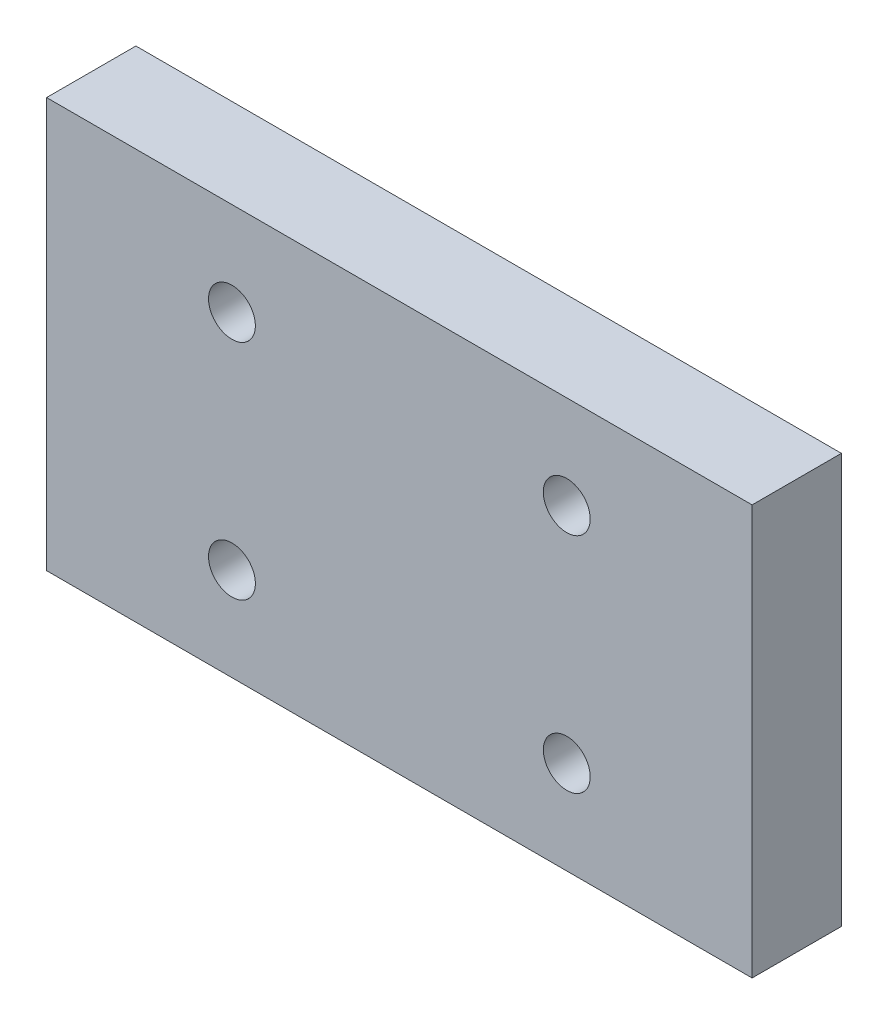
ISO-10303-21;
HEADER;
FILE_DESCRIPTION(('STEP AP214'),'2;1');
FILE_NAME('part.step','',(''),(''),'','','');
FILE_SCHEMA(('AUTOMOTIVE_DESIGN { 1 0 10303 214 1 1 1 1 }'));
ENDSEC;
DATA;
#1=APPLICATION_CONTEXT('core data for automotive mechanical design processes');
#2=APPLICATION_PROTOCOL_DEFINITION('international standard','automotive_design',2000,#1);
#3=PRODUCT_CONTEXT('',#1,'mechanical');
#4=PRODUCT('Part','Part','',(#3));
#5=PRODUCT_RELATED_PRODUCT_CATEGORY('part','',(#4));
#6=PRODUCT_DEFINITION_FORMATION('','',#4);
#7=PRODUCT_DEFINITION_CONTEXT('part definition',#1,'design');
#8=PRODUCT_DEFINITION('design','',#6,#7);
#9=PRODUCT_DEFINITION_SHAPE('','',#8);
#10=(LENGTH_UNIT() NAMED_UNIT(*) SI_UNIT(.MILLI.,.METRE.));
#11=(NAMED_UNIT(*) PLANE_ANGLE_UNIT() SI_UNIT($,.RADIAN.));
#12=(NAMED_UNIT(*) SI_UNIT($,.STERADIAN.) SOLID_ANGLE_UNIT());
#13=UNCERTAINTY_MEASURE_WITH_UNIT(LENGTH_MEASURE(1.E-05),#10,'distance_accuracy_value','');
#14=(GEOMETRIC_REPRESENTATION_CONTEXT(3) GLOBAL_UNCERTAINTY_ASSIGNED_CONTEXT((#13)) GLOBAL_UNIT_ASSIGNED_CONTEXT((#10,
#11,#12)) REPRESENTATION_CONTEXT('',''));
#15=CARTESIAN_POINT('',(0.,0.,0.));
#16=DIRECTION('',(0.,0.,1.));
#17=DIRECTION('',(1.,0.,0.));
#18=AXIS2_PLACEMENT_3D('',#15,#16,#17);
#19=CARTESIAN_POINT('',(0.,0.,8.));
#20=DIRECTION('',(0.,0.,1.));
#21=DIRECTION('',(1.,0.,0.));
#22=AXIS2_PLACEMENT_3D('',#19,#20,#21);
#23=PLANE('',#22);
#24=CARTESIAN_POINT('',(11.1454765817474,-166.,8.));
#25=DIRECTION('',(0.,0.,1.));
#26=DIRECTION('',(1.,0.,0.));
#27=AXIS2_PLACEMENT_3D('',#24,#25,#26);
#28=CIRCLE('',#27,2.1);
#29=CARTESIAN_POINT('',(13.2454765817474,-166.,8.));
#30=VERTEX_POINT('',#29);
#31=EDGE_CURVE('E125',#30,#30,#28,.T.);
#32=ORIENTED_EDGE('',*,*,#31,.F.);
#33=EDGE_LOOP('',(#32));
#34=FACE_BOUND('',#33,.T.);
#35=CARTESIAN_POINT('',(11.1454765817474,-146.,8.));
#36=DIRECTION('',(0.,0.,1.));
#37=DIRECTION('',(1.,0.,0.));
#38=AXIS2_PLACEMENT_3D('',#35,#36,#37);
#39=CIRCLE('',#38,2.1);
#40=CARTESIAN_POINT('',(13.2454765817474,-146.,8.));
#41=VERTEX_POINT('',#40);
#42=EDGE_CURVE('E104',#41,#41,#39,.T.);
#43=ORIENTED_EDGE('',*,*,#42,.F.);
#44=EDGE_LOOP('',(#43));
#45=FACE_BOUND('',#44,.T.);
#46=DIRECTION('',(0.,1.,0.));
#47=VECTOR('',#46,1.);
#48=CARTESIAN_POINT('',(57.7513818619479,-137.644068392094,8.));
#49=LINE('',#48,#47);
#50=CARTESIAN_POINT('',(57.7513818619479,-174.355931607906,8.));
#51=VERTEX_POINT('',#50);
#52=CARTESIAN_POINT('',(57.7513818619479,-137.644068392094,8.));
#53=VERTEX_POINT('',#52);
#54=EDGE_CURVE('E89',#51,#53,#49,.T.);
#55=ORIENTED_EDGE('',*,*,#54,.T.);
#56=DIRECTION('',(-1.,0.,0.));
#57=VECTOR('',#56,1.);
#58=CARTESIAN_POINT('',(-5.46042869845315,-137.644068392094,8.));
#59=LINE('',#58,#57);
#60=CARTESIAN_POINT('',(-5.46042869845315,-137.644068392094,8.));
#61=VERTEX_POINT('',#60);
#62=EDGE_CURVE('E84',#53,#61,#59,.T.);
#63=ORIENTED_EDGE('',*,*,#62,.T.);
#64=DIRECTION('',(0.,-1.,0.));
#65=VECTOR('',#64,1.);
#66=CARTESIAN_POINT('',(-5.46042869845315,-137.644068392094,8.));
#67=LINE('',#66,#65);
#68=CARTESIAN_POINT('',(-5.46042869845315,-174.355931607906,8.));
#69=VERTEX_POINT('',#68);
#70=EDGE_CURVE('E87',#61,#69,#67,.T.);
#71=ORIENTED_EDGE('',*,*,#70,.T.);
#72=DIRECTION('',(1.,0.,0.));
#73=VECTOR('',#72,1.);
#74=CARTESIAN_POINT('',(-5.46042869845315,-174.355931607906,8.));
#75=LINE('',#74,#73);
#76=EDGE_CURVE('E54',#69,#51,#75,.T.);
#77=ORIENTED_EDGE('',*,*,#76,.T.);
#78=EDGE_LOOP('',(#55,#63,#71,#77));
#79=FACE_BOUND('',#78,.T.);
#80=CARTESIAN_POINT('',(41.1454765817474,-146.,8.));
#81=DIRECTION('',(0.,0.,1.));
#82=DIRECTION('',(1.,0.,0.));
#83=AXIS2_PLACEMENT_3D('',#80,#81,#82);
#84=CIRCLE('',#83,2.09999999999999);
#85=CARTESIAN_POINT('',(43.2454765817474,-146.,8.));
#86=VERTEX_POINT('',#85);
#87=EDGE_CURVE('E119',#86,#86,#84,.T.);
#88=ORIENTED_EDGE('',*,*,#87,.F.);
#89=EDGE_LOOP('',(#88));
#90=FACE_BOUND('',#89,.T.);
#91=CARTESIAN_POINT('',(41.1454765817474,-166.,8.));
#92=DIRECTION('',(0.,0.,1.));
#93=DIRECTION('',(1.,0.,0.));
#94=AXIS2_PLACEMENT_3D('',#91,#92,#93);
#95=CIRCLE('',#94,2.09999999999999);
#96=CARTESIAN_POINT('',(43.2454765817474,-166.,8.));
#97=VERTEX_POINT('',#96);
#98=EDGE_CURVE('E131',#97,#97,#95,.T.);
#99=ORIENTED_EDGE('',*,*,#98,.F.);
#100=EDGE_LOOP('',(#99));
#101=FACE_BOUND('',#100,.T.);
#102=ADVANCED_FACE('F37',(#34,#45,#79,#90,#101),#23,.T.);
#103=CARTESIAN_POINT('',(0.,0.,0.));
#104=DIRECTION('',(0.,0.,1.));
#105=DIRECTION('',(1.,0.,0.));
#106=AXIS2_PLACEMENT_3D('',#103,#104,#105);
#107=PLANE('',#106);
#108=DIRECTION('',(0.,1.,0.));
#109=VECTOR('',#108,1.);
#110=CARTESIAN_POINT('',(57.7513818619479,-137.644068392094,0.));
#111=LINE('',#110,#109);
#112=CARTESIAN_POINT('',(57.7513818619479,-174.355931607906,0.));
#113=VERTEX_POINT('',#112);
#114=CARTESIAN_POINT('',(57.7513818619479,-137.644068392094,0.));
#115=VERTEX_POINT('',#114);
#116=EDGE_CURVE('E101',#113,#115,#111,.T.);
#117=ORIENTED_EDGE('',*,*,#116,.F.);
#118=DIRECTION('',(1.,0.,0.));
#119=VECTOR('',#118,1.);
#120=CARTESIAN_POINT('',(-5.46042869845315,-174.355931607906,0.));
#121=LINE('',#120,#119);
#122=CARTESIAN_POINT('',(-5.46042869845315,-174.355931607906,0.));
#123=VERTEX_POINT('',#122);
#124=EDGE_CURVE('E77',#123,#113,#121,.T.);
#125=ORIENTED_EDGE('',*,*,#124,.F.);
#126=DIRECTION('',(0.,-1.,0.));
#127=VECTOR('',#126,1.);
#128=CARTESIAN_POINT('',(-5.46042869845315,-137.644068392094,0.));
#129=LINE('',#128,#127);
#130=CARTESIAN_POINT('',(-5.46042869845315,-137.644068392094,0.));
#131=VERTEX_POINT('',#130);
#132=EDGE_CURVE('E71',#131,#123,#129,.T.);
#133=ORIENTED_EDGE('',*,*,#132,.F.);
#134=DIRECTION('',(-1.,0.,0.));
#135=VECTOR('',#134,1.);
#136=CARTESIAN_POINT('',(-5.46042869845315,-137.644068392094,0.));
#137=LINE('',#136,#135);
#138=EDGE_CURVE('E93',#115,#131,#137,.T.);
#139=ORIENTED_EDGE('',*,*,#138,.F.);
#140=EDGE_LOOP('',(#117,#125,#133,#139));
#141=FACE_BOUND('',#140,.T.);
#142=CARTESIAN_POINT('',(11.1454765817474,-146.,0.));
#143=DIRECTION('',(0.,0.,1.));
#144=DIRECTION('',(1.,0.,0.));
#145=AXIS2_PLACEMENT_3D('',#142,#143,#144);
#146=CIRCLE('',#145,2.1);
#147=CARTESIAN_POINT('',(13.2454765817474,-146.,0.));
#148=VERTEX_POINT('',#147);
#149=EDGE_CURVE('E116',#148,#148,#146,.T.);
#150=ORIENTED_EDGE('',*,*,#149,.T.);
#151=EDGE_LOOP('',(#150));
#152=FACE_BOUND('',#151,.T.);
#153=CARTESIAN_POINT('',(41.1454765817474,-146.,0.));
#154=DIRECTION('',(0.,0.,1.));
#155=DIRECTION('',(1.,0.,0.));
#156=AXIS2_PLACEMENT_3D('',#153,#154,#155);
#157=CIRCLE('',#156,2.09999999999999);
#158=CARTESIAN_POINT('',(43.2454765817474,-146.,0.));
#159=VERTEX_POINT('',#158);
#160=EDGE_CURVE('E122',#159,#159,#157,.T.);
#161=ORIENTED_EDGE('',*,*,#160,.T.);
#162=EDGE_LOOP('',(#161));
#163=FACE_BOUND('',#162,.T.);
#164=CARTESIAN_POINT('',(11.1454765817474,-166.,0.));
#165=DIRECTION('',(0.,0.,1.));
#166=DIRECTION('',(1.,0.,0.));
#167=AXIS2_PLACEMENT_3D('',#164,#165,#166);
#168=CIRCLE('',#167,2.1);
#169=CARTESIAN_POINT('',(13.2454765817474,-166.,0.));
#170=VERTEX_POINT('',#169);
#171=EDGE_CURVE('E128',#170,#170,#168,.T.);
#172=ORIENTED_EDGE('',*,*,#171,.T.);
#173=EDGE_LOOP('',(#172));
#174=FACE_BOUND('',#173,.T.);
#175=CARTESIAN_POINT('',(41.1454765817474,-166.,0.));
#176=DIRECTION('',(0.,0.,1.));
#177=DIRECTION('',(1.,0.,0.));
#178=AXIS2_PLACEMENT_3D('',#175,#176,#177);
#179=CIRCLE('',#178,2.09999999999999);
#180=CARTESIAN_POINT('',(43.2454765817474,-166.,0.));
#181=VERTEX_POINT('',#180);
#182=EDGE_CURVE('E134',#181,#181,#179,.T.);
#183=ORIENTED_EDGE('',*,*,#182,.T.);
#184=EDGE_LOOP('',(#183));
#185=FACE_BOUND('',#184,.T.);
#186=ADVANCED_FACE('F112',(#141,#152,#163,#174,#185),#107,.F.);
#187=CARTESIAN_POINT('',(57.7513818619479,-137.644068392094,8.));
#188=DIRECTION('',(-1.,0.,0.));
#189=DIRECTION('',(0.,0.,1.));
#190=AXIS2_PLACEMENT_3D('',#187,#188,#189);
#191=PLANE('',#190);
#192=ORIENTED_EDGE('',*,*,#116,.T.);
#193=DIRECTION('',(0.,0.,-1.));
#194=VECTOR('',#193,1.);
#195=CARTESIAN_POINT('',(57.7513818619479,-137.644068392094,8.));
#196=LINE('',#195,#194);
#197=EDGE_CURVE('E11',#53,#115,#196,.T.);
#198=ORIENTED_EDGE('',*,*,#197,.F.);
#199=ORIENTED_EDGE('',*,*,#54,.F.);
#200=DIRECTION('',(0.,0.,-1.));
#201=VECTOR('',#200,1.);
#202=CARTESIAN_POINT('',(57.7513818619479,-174.355931607906,8.));
#203=LINE('',#202,#201);
#204=EDGE_CURVE('E97',#51,#113,#203,.T.);
#205=ORIENTED_EDGE('',*,*,#204,.T.);
#206=EDGE_LOOP('',(#192,#198,#199,#205));
#207=FACE_BOUND('',#206,.T.);
#208=ADVANCED_FACE('F39',(#207),#191,.F.);
#209=CARTESIAN_POINT('',(-5.46042869845315,-137.644068392094,8.));
#210=DIRECTION('',(0.,-1.,0.));
#211=DIRECTION('',(0.,0.,-1.));
#212=AXIS2_PLACEMENT_3D('',#209,#210,#211);
#213=PLANE('',#212);
#214=ORIENTED_EDGE('',*,*,#138,.T.);
#215=DIRECTION('',(0.,0.,-1.));
#216=VECTOR('',#215,1.);
#217=CARTESIAN_POINT('',(-5.46042869845315,-137.644068392094,8.));
#218=LINE('',#217,#216);
#219=EDGE_CURVE('E46',#61,#131,#218,.T.);
#220=ORIENTED_EDGE('',*,*,#219,.F.);
#221=ORIENTED_EDGE('',*,*,#62,.F.);
#222=ORIENTED_EDGE('',*,*,#197,.T.);
#223=EDGE_LOOP('',(#214,#220,#221,#222));
#224=FACE_BOUND('',#223,.T.);
#225=ADVANCED_FACE('F92',(#224),#213,.F.);
#226=CARTESIAN_POINT('',(-5.46042869845315,-137.644068392094,8.));
#227=DIRECTION('',(1.,0.,0.));
#228=DIRECTION('',(0.,0.,-1.));
#229=AXIS2_PLACEMENT_3D('',#226,#227,#228);
#230=PLANE('',#229);
#231=ORIENTED_EDGE('',*,*,#132,.T.);
#232=DIRECTION('',(0.,0.,-1.));
#233=VECTOR('',#232,1.);
#234=CARTESIAN_POINT('',(-5.46042869845315,-174.355931607906,8.));
#235=LINE('',#234,#233);
#236=EDGE_CURVE('E94',#69,#123,#235,.T.);
#237=ORIENTED_EDGE('',*,*,#236,.F.);
#238=ORIENTED_EDGE('',*,*,#70,.F.);
#239=ORIENTED_EDGE('',*,*,#219,.T.);
#240=EDGE_LOOP('',(#231,#237,#238,#239));
#241=FACE_BOUND('',#240,.T.);
#242=ADVANCED_FACE('F95',(#241),#230,.F.);
#243=CARTESIAN_POINT('',(-5.46042869845315,-174.355931607906,8.));
#244=DIRECTION('',(0.,1.,0.));
#245=DIRECTION('',(0.,0.,1.));
#246=AXIS2_PLACEMENT_3D('',#243,#244,#245);
#247=PLANE('',#246);
#248=ORIENTED_EDGE('',*,*,#124,.T.);
#249=ORIENTED_EDGE('',*,*,#204,.F.);
#250=ORIENTED_EDGE('',*,*,#76,.F.);
#251=ORIENTED_EDGE('',*,*,#236,.T.);
#252=EDGE_LOOP('',(#248,#249,#250,#251));
#253=FACE_BOUND('',#252,.T.);
#254=ADVANCED_FACE('F109',(#253),#247,.F.);
#255=CARTESIAN_POINT('',(11.1454765817474,-146.,8.));
#256=DIRECTION('',(0.,0.,-1.));
#257=DIRECTION('',(-1.,0.,0.));
#258=AXIS2_PLACEMENT_3D('',#255,#256,#257);
#259=CYLINDRICAL_SURFACE('',#258,2.1);
#260=ORIENTED_EDGE('',*,*,#42,.T.);
#261=EDGE_LOOP('',(#260));
#262=FACE_BOUND('',#261,.T.);
#263=ORIENTED_EDGE('',*,*,#149,.F.);
#264=EDGE_LOOP('',(#263));
#265=FACE_BOUND('',#264,.T.);
#266=ADVANCED_FACE('F153',(#262,#265),#259,.F.);
#267=CARTESIAN_POINT('',(41.1454765817474,-146.,8.));
#268=DIRECTION('',(0.,0.,-1.));
#269=DIRECTION('',(-1.,0.,0.));
#270=AXIS2_PLACEMENT_3D('',#267,#268,#269);
#271=CYLINDRICAL_SURFACE('',#270,2.09999999999999);
#272=ORIENTED_EDGE('',*,*,#87,.T.);
#273=EDGE_LOOP('',(#272));
#274=FACE_BOUND('',#273,.T.);
#275=ORIENTED_EDGE('',*,*,#160,.F.);
#276=EDGE_LOOP('',(#275));
#277=FACE_BOUND('',#276,.T.);
#278=ADVANCED_FACE('F205',(#274,#277),#271,.F.);
#279=CARTESIAN_POINT('',(11.1454765817474,-166.,8.));
#280=DIRECTION('',(0.,0.,-1.));
#281=DIRECTION('',(-1.,0.,0.));
#282=AXIS2_PLACEMENT_3D('',#279,#280,#281);
#283=CYLINDRICAL_SURFACE('',#282,2.1);
#284=ORIENTED_EDGE('',*,*,#31,.T.);
#285=EDGE_LOOP('',(#284));
#286=FACE_BOUND('',#285,.T.);
#287=ORIENTED_EDGE('',*,*,#171,.F.);
#288=EDGE_LOOP('',(#287));
#289=FACE_BOUND('',#288,.T.);
#290=ADVANCED_FACE('F214',(#286,#289),#283,.F.);
#291=CARTESIAN_POINT('',(41.1454765817474,-166.,8.));
#292=DIRECTION('',(0.,0.,-1.));
#293=DIRECTION('',(-1.,0.,0.));
#294=AXIS2_PLACEMENT_3D('',#291,#292,#293);
#295=CYLINDRICAL_SURFACE('',#294,2.09999999999999);
#296=ORIENTED_EDGE('',*,*,#98,.T.);
#297=EDGE_LOOP('',(#296));
#298=FACE_BOUND('',#297,.T.);
#299=ORIENTED_EDGE('',*,*,#182,.F.);
#300=EDGE_LOOP('',(#299));
#301=FACE_BOUND('',#300,.T.);
#302=ADVANCED_FACE('F140',(#298,#301),#295,.F.);
#303=CLOSED_SHELL('',(#102,#186,#208,#225,#242,#254,#266,#278,#290,#302));
#304=MANIFOLD_SOLID_BREP('B2',#303);
#305=ADVANCED_BREP_SHAPE_REPRESENTATION('',(#18,#304),#14);
#306=SHAPE_DEFINITION_REPRESENTATION(#9,#305);
ENDSEC;
END-ISO-10303-21;
